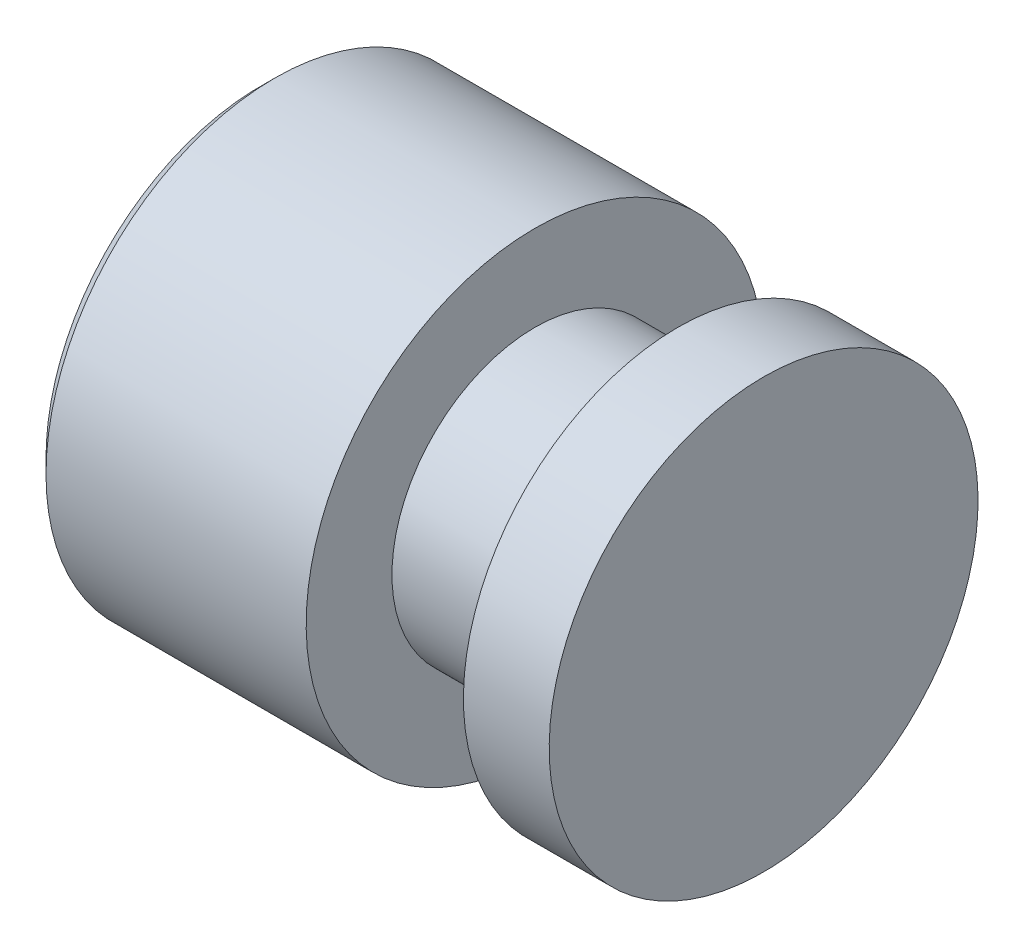
ISO-10303-21;
HEADER;
FILE_DESCRIPTION(('STEP AP214'),'2;1');
FILE_NAME('part.step','',(''),(''),'','','');
FILE_SCHEMA(('AUTOMOTIVE_DESIGN { 1 0 10303 214 1 1 1 1 }'));
ENDSEC;
DATA;
#1=APPLICATION_CONTEXT('core data for automotive mechanical design processes');
#2=APPLICATION_PROTOCOL_DEFINITION('international standard','automotive_design',2000,#1);
#3=PRODUCT_CONTEXT('',#1,'mechanical');
#4=PRODUCT('Part','Part','',(#3));
#5=PRODUCT_RELATED_PRODUCT_CATEGORY('part','',(#4));
#6=PRODUCT_DEFINITION_FORMATION('','',#4);
#7=PRODUCT_DEFINITION_CONTEXT('part definition',#1,'design');
#8=PRODUCT_DEFINITION('design','',#6,#7);
#9=PRODUCT_DEFINITION_SHAPE('','',#8);
#10=(LENGTH_UNIT() NAMED_UNIT(*) SI_UNIT(.MILLI.,.METRE.));
#11=(NAMED_UNIT(*) PLANE_ANGLE_UNIT() SI_UNIT($,.RADIAN.));
#12=(NAMED_UNIT(*) SI_UNIT($,.STERADIAN.) SOLID_ANGLE_UNIT());
#13=UNCERTAINTY_MEASURE_WITH_UNIT(LENGTH_MEASURE(1.E-05),#10,'distance_accuracy_value','');
#14=(GEOMETRIC_REPRESENTATION_CONTEXT(3) GLOBAL_UNCERTAINTY_ASSIGNED_CONTEXT((#13)) GLOBAL_UNIT_ASSIGNED_CONTEXT((#10,
#11,#12)) REPRESENTATION_CONTEXT('',''));
#15=CARTESIAN_POINT('',(0.,0.,0.));
#16=DIRECTION('',(0.,0.,1.));
#17=DIRECTION('',(1.,0.,0.));
#18=AXIS2_PLACEMENT_3D('',#15,#16,#17);
#19=CARTESIAN_POINT('',(17.6,0.,0.));
#20=DIRECTION('',(1.,0.,0.));
#21=DIRECTION('',(0.,1.,0.));
#22=AXIS2_PLACEMENT_3D('',#19,#20,#21);
#23=CYLINDRICAL_SURFACE('',#22,5.);
#24=CARTESIAN_POINT('',(9.6,0.,0.));
#25=DIRECTION('',(1.,0.,0.));
#26=DIRECTION('',(0.,1.,0.));
#27=AXIS2_PLACEMENT_3D('',#24,#25,#26);
#28=CIRCLE('',#27,5.);
#29=CARTESIAN_POINT('',(9.6,5.,0.));
#30=VERTEX_POINT('',#29);
#31=EDGE_CURVE('E56',#30,#30,#28,.T.);
#32=ORIENTED_EDGE('',*,*,#31,.T.);
#33=EDGE_LOOP('',(#32));
#34=FACE_BOUND('',#33,.T.);
#35=CARTESIAN_POINT('',(14.6,0.,0.));
#36=DIRECTION('',(1.,0.,0.));
#37=DIRECTION('',(0.,1.,0.));
#38=AXIS2_PLACEMENT_3D('',#35,#36,#37);
#39=CIRCLE('',#38,5.);
#40=CARTESIAN_POINT('',(14.6,5.,0.));
#41=VERTEX_POINT('',#40);
#42=EDGE_CURVE('E65',#41,#41,#39,.T.);
#43=ORIENTED_EDGE('',*,*,#42,.F.);
#44=EDGE_LOOP('',(#43));
#45=FACE_BOUND('',#44,.T.);
#46=ADVANCED_FACE('F40',(#34,#45),#23,.T.);
#47=CARTESIAN_POINT('',(0.,0.,0.));
#48=DIRECTION('',(-1.,0.,0.));
#49=DIRECTION('',(0.,-1.,0.));
#50=AXIS2_PLACEMENT_3D('',#47,#48,#49);
#51=PLANE('',#50);
#52=CARTESIAN_POINT('',(0.,0.,0.));
#53=DIRECTION('',(-1.,0.,0.));
#54=DIRECTION('',(0.,-1.,0.));
#55=AXIS2_PLACEMENT_3D('',#52,#53,#54);
#56=CIRCLE('',#55,7.5);
#57=CARTESIAN_POINT('',(0.,-7.5,0.));
#58=VERTEX_POINT('',#57);
#59=EDGE_CURVE('E10',#58,#58,#56,.T.);
#60=ORIENTED_EDGE('',*,*,#59,.T.);
#61=EDGE_LOOP('',(#60));
#62=FACE_BOUND('',#61,.T.);
#63=ADVANCED_FACE('F75',(#62),#51,.T.);
#64=CARTESIAN_POINT('',(17.6,0.,0.));
#65=DIRECTION('',(1.,0.,0.));
#66=DIRECTION('',(0.,1.,0.));
#67=AXIS2_PLACEMENT_3D('',#64,#65,#66);
#68=CYLINDRICAL_SURFACE('',#67,8.);
#69=CARTESIAN_POINT('',(0.5,0.,0.));
#70=DIRECTION('',(-1.,0.,0.));
#71=DIRECTION('',(0.,-1.,0.));
#72=AXIS2_PLACEMENT_3D('',#69,#70,#71);
#73=CIRCLE('',#72,8.);
#74=CARTESIAN_POINT('',(0.5,-8.,0.));
#75=VERTEX_POINT('',#74);
#76=EDGE_CURVE('E48',#75,#75,#73,.F.);
#77=ORIENTED_EDGE('',*,*,#76,.T.);
#78=EDGE_LOOP('',(#77));
#79=FACE_BOUND('',#78,.T.);
#80=CARTESIAN_POINT('',(9.6,0.,0.));
#81=DIRECTION('',(1.,0.,0.));
#82=DIRECTION('',(0.,1.,0.));
#83=AXIS2_PLACEMENT_3D('',#80,#81,#82);
#84=CIRCLE('',#83,8.);
#85=CARTESIAN_POINT('',(9.6,8.,0.));
#86=VERTEX_POINT('',#85);
#87=EDGE_CURVE('E52',#86,#86,#84,.T.);
#88=ORIENTED_EDGE('',*,*,#87,.F.);
#89=EDGE_LOOP('',(#88));
#90=FACE_BOUND('',#89,.T.);
#91=ADVANCED_FACE('F81',(#79,#90),#68,.T.);
#92=CARTESIAN_POINT('',(9.6,8.,0.));
#93=DIRECTION('',(1.,0.,0.));
#94=DIRECTION('',(0.,1.,0.));
#95=AXIS2_PLACEMENT_3D('',#92,#93,#94);
#96=PLANE('',#95);
#97=ORIENTED_EDGE('',*,*,#87,.T.);
#98=EDGE_LOOP('',(#97));
#99=FACE_BOUND('',#98,.T.);
#100=ORIENTED_EDGE('',*,*,#31,.F.);
#101=EDGE_LOOP('',(#100));
#102=FACE_BOUND('',#101,.T.);
#103=ADVANCED_FACE('F86',(#99,#102),#96,.T.);
#104=CARTESIAN_POINT('',(0.5,0.,0.));
#105=DIRECTION('',(1.,0.,0.));
#106=DIRECTION('',(0.,1.,0.));
#107=AXIS2_PLACEMENT_3D('',#104,#105,#106);
#108=CONICAL_SURFACE('',#107,8.,0.785398163397452);
#109=ORIENTED_EDGE('',*,*,#59,.F.);
#110=EDGE_LOOP('',(#109));
#111=FACE_BOUND('',#110,.T.);
#112=ORIENTED_EDGE('',*,*,#76,.F.);
#113=EDGE_LOOP('',(#112));
#114=FACE_BOUND('',#113,.T.);
#115=ADVANCED_FACE('F43',(#111,#114),#108,.T.);
#116=CARTESIAN_POINT('',(14.6,0.,0.));
#117=DIRECTION('',(1.,0.,0.));
#118=DIRECTION('',(0.,1.,0.));
#119=AXIS2_PLACEMENT_3D('',#116,#117,#118);
#120=CYLINDRICAL_SURFACE('',#119,7.5);
#121=CARTESIAN_POINT('',(14.6,0.,0.));
#122=DIRECTION('',(1.,0.,0.));
#123=DIRECTION('',(0.,1.,0.));
#124=AXIS2_PLACEMENT_3D('',#121,#122,#123);
#125=CIRCLE('',#124,7.5);
#126=CARTESIAN_POINT('',(14.6,7.5,0.));
#127=VERTEX_POINT('',#126);
#128=EDGE_CURVE('E61',#127,#127,#125,.T.);
#129=ORIENTED_EDGE('',*,*,#128,.T.);
#130=EDGE_LOOP('',(#129));
#131=FACE_BOUND('',#130,.T.);
#132=CARTESIAN_POINT('',(17.6,0.,0.));
#133=DIRECTION('',(1.,0.,0.));
#134=DIRECTION('',(0.,1.,0.));
#135=AXIS2_PLACEMENT_3D('',#132,#133,#134);
#136=CIRCLE('',#135,7.5);
#137=CARTESIAN_POINT('',(17.6,7.5,0.));
#138=VERTEX_POINT('',#137);
#139=EDGE_CURVE('E62',#138,#138,#136,.T.);
#140=ORIENTED_EDGE('',*,*,#139,.F.);
#141=EDGE_LOOP('',(#140));
#142=FACE_BOUND('',#141,.T.);
#143=ADVANCED_FACE('F109',(#131,#142),#120,.T.);
#144=CARTESIAN_POINT('',(14.6,0.,0.));
#145=DIRECTION('',(1.,0.,0.));
#146=DIRECTION('',(0.,1.,0.));
#147=AXIS2_PLACEMENT_3D('',#144,#145,#146);
#148=PLANE('',#147);
#149=ORIENTED_EDGE('',*,*,#42,.T.);
#150=EDGE_LOOP('',(#149));
#151=FACE_BOUND('',#150,.T.);
#152=ORIENTED_EDGE('',*,*,#128,.F.);
#153=EDGE_LOOP('',(#152));
#154=FACE_BOUND('',#153,.T.);
#155=ADVANCED_FACE('F71',(#151,#154),#148,.F.);
#156=CARTESIAN_POINT('',(17.6,5.,0.));
#157=DIRECTION('',(1.,0.,0.));
#158=DIRECTION('',(0.,1.,0.));
#159=AXIS2_PLACEMENT_3D('',#156,#157,#158);
#160=PLANE('',#159);
#161=ORIENTED_EDGE('',*,*,#139,.T.);
#162=EDGE_LOOP('',(#161));
#163=FACE_BOUND('',#162,.T.);
#164=ADVANCED_FACE('F84',(#163),#160,.T.);
#165=CLOSED_SHELL('',(#46,#63,#91,#103,#115,#143,#155,#164));
#166=MANIFOLD_SOLID_BREP('B2',#165);
#167=ADVANCED_BREP_SHAPE_REPRESENTATION('',(#18,#166),#14);
#168=SHAPE_DEFINITION_REPRESENTATION(#9,#167);
ENDSEC;
END-ISO-10303-21;
